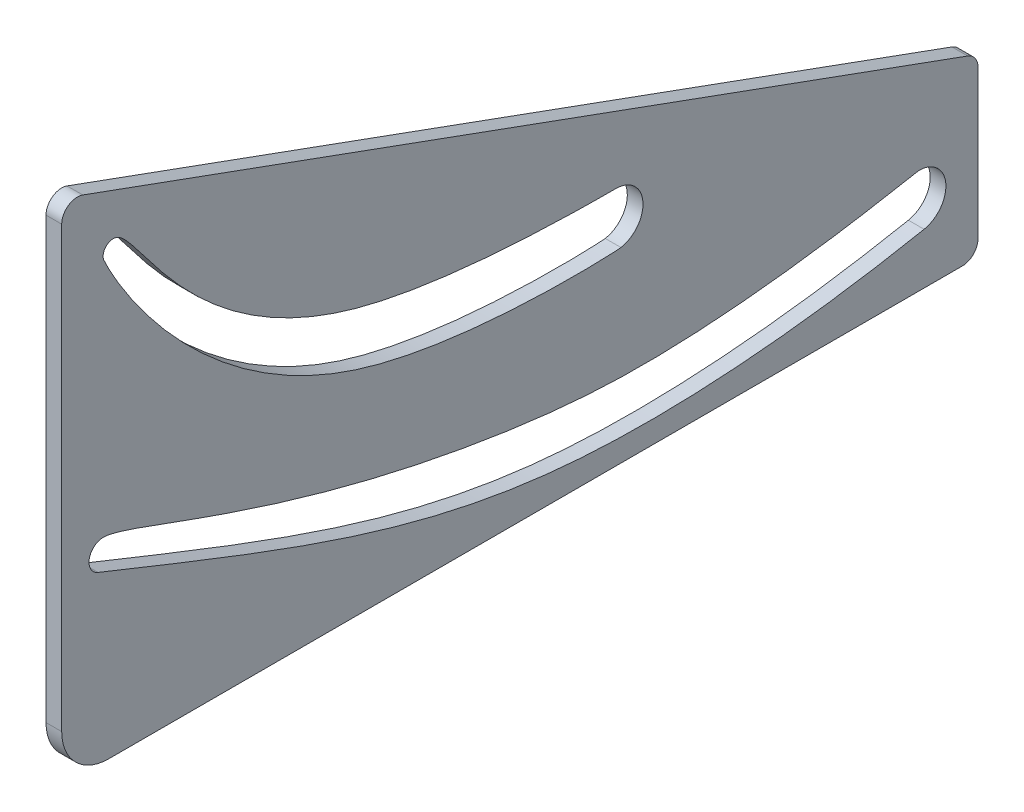
ISO-10303-21;
HEADER;
FILE_DESCRIPTION(('STEP AP214'),'2;1');
FILE_NAME('part.step','',(''),(''),'','','');
FILE_SCHEMA(('AUTOMOTIVE_DESIGN { 1 0 10303 214 1 1 1 1 }'));
ENDSEC;
DATA;
#1=APPLICATION_CONTEXT('core data for automotive mechanical design processes');
#2=APPLICATION_PROTOCOL_DEFINITION('international standard','automotive_design',2000,#1);
#3=PRODUCT_CONTEXT('',#1,'mechanical');
#4=PRODUCT('Part','Part','',(#3));
#5=PRODUCT_RELATED_PRODUCT_CATEGORY('part','',(#4));
#6=PRODUCT_DEFINITION_FORMATION('','',#4);
#7=PRODUCT_DEFINITION_CONTEXT('part definition',#1,'design');
#8=PRODUCT_DEFINITION('design','',#6,#7);
#9=PRODUCT_DEFINITION_SHAPE('','',#8);
#10=(LENGTH_UNIT() NAMED_UNIT(*) SI_UNIT(.MILLI.,.METRE.));
#11=(NAMED_UNIT(*) PLANE_ANGLE_UNIT() SI_UNIT($,.RADIAN.));
#12=(NAMED_UNIT(*) SI_UNIT($,.STERADIAN.) SOLID_ANGLE_UNIT());
#13=UNCERTAINTY_MEASURE_WITH_UNIT(LENGTH_MEASURE(1.E-05),#10,'distance_accuracy_value','');
#14=(GEOMETRIC_REPRESENTATION_CONTEXT(3) GLOBAL_UNCERTAINTY_ASSIGNED_CONTEXT((#13)) GLOBAL_UNIT_ASSIGNED_CONTEXT((#10,
#11,#12)) REPRESENTATION_CONTEXT('',''));
#15=CARTESIAN_POINT('',(0.,0.,0.));
#16=DIRECTION('',(0.,0.,1.));
#17=DIRECTION('',(1.,0.,0.));
#18=AXIS2_PLACEMENT_3D('',#15,#16,#17);
#19=CARTESIAN_POINT('',(10.,-294.281480067421,-30.));
#20=DIRECTION('',(-1.,0.,0.));
#21=DIRECTION('',(0.,0.,1.));
#22=AXIS2_PLACEMENT_3D('',#19,#20,#21);
#23=CYLINDRICAL_SURFACE('',#22,30.);
#24=CARTESIAN_POINT('',(0.,-294.281480067421,-30.));
#25=DIRECTION('',(1.,0.,0.));
#26=DIRECTION('',(0.,0.,1.));
#27=AXIS2_PLACEMENT_3D('',#24,#25,#26);
#28=CIRCLE('',#27,30.);
#29=CARTESIAN_POINT('',(0.,-294.281480067421,0.));
#30=VERTEX_POINT('',#29);
#31=CARTESIAN_POINT('',(0.,-324.281480067421,-30.));
#32=VERTEX_POINT('',#31);
#33=EDGE_CURVE('E251',#30,#32,#28,.T.);
#34=ORIENTED_EDGE('',*,*,#33,.T.);
#35=DIRECTION('',(-1.,0.,0.));
#36=VECTOR('',#35,1.);
#37=CARTESIAN_POINT('',(10.,-324.281480067421,-30.));
#38=LINE('',#37,#36);
#39=CARTESIAN_POINT('',(10.,-324.281480067421,-30.));
#40=VERTEX_POINT('',#39);
#41=EDGE_CURVE('E11',#40,#32,#38,.T.);
#42=ORIENTED_EDGE('',*,*,#41,.F.);
#43=CARTESIAN_POINT('',(10.,-294.281480067421,-30.));
#44=DIRECTION('',(1.,0.,0.));
#45=DIRECTION('',(0.,0.,1.));
#46=AXIS2_PLACEMENT_3D('',#43,#44,#45);
#47=CIRCLE('',#46,30.);
#48=CARTESIAN_POINT('',(10.,-294.281480067421,0.));
#49=VERTEX_POINT('',#48);
#50=EDGE_CURVE('E272',#49,#40,#47,.T.);
#51=ORIENTED_EDGE('',*,*,#50,.F.);
#52=DIRECTION('',(-1.,0.,0.));
#53=VECTOR('',#52,1.);
#54=CARTESIAN_POINT('',(10.,-294.281480067421,0.));
#55=LINE('',#54,#53);
#56=EDGE_CURVE('E273',#49,#30,#55,.T.);
#57=ORIENTED_EDGE('',*,*,#56,.T.);
#58=EDGE_LOOP('',(#34,#42,#51,#57));
#59=FACE_BOUND('',#58,.T.);
#60=ADVANCED_FACE('F36',(#59),#23,.T.);
#61=CARTESIAN_POINT('',(10.,-324.281480067421,-30.));
#62=DIRECTION('',(0.,1.,0.));
#63=DIRECTION('',(0.,0.,1.));
#64=AXIS2_PLACEMENT_3D('',#61,#62,#63);
#65=PLANE('',#64);
#66=DIRECTION('',(0.,0.,-1.));
#67=VECTOR('',#66,1.);
#68=CARTESIAN_POINT('',(0.,-324.281480067421,-30.));
#69=LINE('',#68,#67);
#70=CARTESIAN_POINT('',(0.,-324.281480067421,-573.815572471544));
#71=VERTEX_POINT('',#70);
#72=EDGE_CURVE('E242',#32,#71,#69,.T.);
#73=ORIENTED_EDGE('',*,*,#72,.T.);
#74=DIRECTION('',(-1.,0.,0.));
#75=VECTOR('',#74,1.);
#76=CARTESIAN_POINT('',(10.,-324.281480067421,-573.815572471544));
#77=LINE('',#76,#75);
#78=CARTESIAN_POINT('',(10.,-324.281480067421,-573.815572471544));
#79=VERTEX_POINT('',#78);
#80=EDGE_CURVE('E43',#79,#71,#77,.T.);
#81=ORIENTED_EDGE('',*,*,#80,.F.);
#82=DIRECTION('',(0.,0.,-1.));
#83=VECTOR('',#82,1.);
#84=CARTESIAN_POINT('',(10.,-324.281480067421,-30.));
#85=LINE('',#84,#83);
#86=EDGE_CURVE('E298',#40,#79,#85,.T.);
#87=ORIENTED_EDGE('',*,*,#86,.F.);
#88=ORIENTED_EDGE('',*,*,#41,.T.);
#89=EDGE_LOOP('',(#73,#81,#87,#88));
#90=FACE_BOUND('',#89,.T.);
#91=ADVANCED_FACE('F233',(#90),#65,.F.);
#92=CARTESIAN_POINT('',(10.,-314.281480067421,-573.815572471544));
#93=DIRECTION('',(-1.,0.,0.));
#94=DIRECTION('',(0.,0.,1.));
#95=AXIS2_PLACEMENT_3D('',#92,#93,#94);
#96=CYLINDRICAL_SURFACE('',#95,10.);
#97=CARTESIAN_POINT('',(0.,-314.281480067421,-573.815572471544));
#98=DIRECTION('',(1.,0.,0.));
#99=DIRECTION('',(0.,0.,-1.));
#100=AXIS2_PLACEMENT_3D('',#97,#98,#99);
#101=CIRCLE('',#100,10.);
#102=CARTESIAN_POINT('',(0.,-314.281480067421,-583.815572471544));
#103=VERTEX_POINT('',#102);
#104=EDGE_CURVE('E250',#71,#103,#101,.T.);
#105=ORIENTED_EDGE('',*,*,#104,.T.);
#106=DIRECTION('',(-1.,0.,0.));
#107=VECTOR('',#106,1.);
#108=CARTESIAN_POINT('',(10.,-314.281480067421,-583.815572471544));
#109=LINE('',#108,#107);
#110=CARTESIAN_POINT('',(10.,-314.281480067421,-583.815572471544));
#111=VERTEX_POINT('',#110);
#112=EDGE_CURVE('E256',#111,#103,#109,.T.);
#113=ORIENTED_EDGE('',*,*,#112,.F.);
#114=CARTESIAN_POINT('',(10.,-314.281480067421,-573.815572471544));
#115=DIRECTION('',(1.,0.,0.));
#116=DIRECTION('',(0.,0.,-1.));
#117=AXIS2_PLACEMENT_3D('',#114,#115,#116);
#118=CIRCLE('',#117,10.);
#119=EDGE_CURVE('E255',#79,#111,#118,.T.);
#120=ORIENTED_EDGE('',*,*,#119,.F.);
#121=ORIENTED_EDGE('',*,*,#80,.T.);
#122=EDGE_LOOP('',(#105,#113,#120,#121));
#123=FACE_BOUND('',#122,.T.);
#124=ADVANCED_FACE('F230',(#123),#96,.T.);
#125=CARTESIAN_POINT('',(10.,-314.281480067421,-583.815572471544));
#126=DIRECTION('',(0.,0.,1.));
#127=DIRECTION('',(1.,0.,0.));
#128=AXIS2_PLACEMENT_3D('',#125,#126,#127);
#129=PLANE('',#128);
#130=DIRECTION('',(0.,1.,0.));
#131=VECTOR('',#130,1.);
#132=CARTESIAN_POINT('',(0.,-314.281480067421,-583.815572471544));
#133=LINE('',#132,#131);
#134=CARTESIAN_POINT('',(0.,-219.493566062825,-583.815572471544));
#135=VERTEX_POINT('',#134);
#136=EDGE_CURVE('E259',#103,#135,#133,.T.);
#137=ORIENTED_EDGE('',*,*,#136,.T.);
#138=DIRECTION('',(-1.,0.,0.));
#139=VECTOR('',#138,1.);
#140=CARTESIAN_POINT('',(10.,-219.493566062825,-583.815572471544));
#141=LINE('',#140,#139);
#142=CARTESIAN_POINT('',(10.,-219.493566062825,-583.815572471544));
#143=VERTEX_POINT('',#142);
#144=EDGE_CURVE('E286',#143,#135,#141,.T.);
#145=ORIENTED_EDGE('',*,*,#144,.F.);
#146=DIRECTION('',(0.,1.,0.));
#147=VECTOR('',#146,1.);
#148=CARTESIAN_POINT('',(10.,-314.281480067421,-583.815572471544));
#149=LINE('',#148,#147);
#150=EDGE_CURVE('E291',#111,#143,#149,.T.);
#151=ORIENTED_EDGE('',*,*,#150,.F.);
#152=ORIENTED_EDGE('',*,*,#112,.T.);
#153=EDGE_LOOP('',(#137,#145,#151,#152));
#154=FACE_BOUND('',#153,.T.);
#155=ADVANCED_FACE('F226',(#154),#129,.F.);
#156=CARTESIAN_POINT('',(10.,-219.493566062825,-573.815572471544));
#157=DIRECTION('',(-1.,0.,0.));
#158=DIRECTION('',(0.,0.,1.));
#159=AXIS2_PLACEMENT_3D('',#156,#157,#158);
#160=CYLINDRICAL_SURFACE('',#159,10.);
#161=CARTESIAN_POINT('',(0.,-219.493566062825,-573.815572471544));
#162=DIRECTION('',(1.,0.,0.));
#163=DIRECTION('',(0.,0.,-1.));
#164=AXIS2_PLACEMENT_3D('',#161,#162,#163);
#165=CIRCLE('',#164,10.);
#166=CARTESIAN_POINT('',(0.,-210.096639854966,-577.235773904801));
#167=VERTEX_POINT('',#166);
#168=EDGE_CURVE('E261',#135,#167,#165,.T.);
#169=ORIENTED_EDGE('',*,*,#168,.T.);
#170=DIRECTION('',(-1.,0.,0.));
#171=VECTOR('',#170,1.);
#172=CARTESIAN_POINT('',(10.,-210.096639854966,-577.235773904801));
#173=LINE('',#172,#171);
#174=CARTESIAN_POINT('',(10.,-210.096639854966,-577.235773904801));
#175=VERTEX_POINT('',#174);
#176=EDGE_CURVE('E283',#175,#167,#173,.T.);
#177=ORIENTED_EDGE('',*,*,#176,.F.);
#178=CARTESIAN_POINT('',(10.,-219.493566062825,-573.815572471544));
#179=DIRECTION('',(1.,0.,0.));
#180=DIRECTION('',(0.,0.,-1.));
#181=AXIS2_PLACEMENT_3D('',#178,#179,#180);
#182=CIRCLE('',#181,10.);
#183=EDGE_CURVE('E294',#143,#175,#182,.T.);
#184=ORIENTED_EDGE('',*,*,#183,.F.);
#185=ORIENTED_EDGE('',*,*,#144,.T.);
#186=EDGE_LOOP('',(#169,#177,#184,#185));
#187=FACE_BOUND('',#186,.T.);
#188=ADVANCED_FACE('F222',(#187),#160,.T.);
#189=CARTESIAN_POINT('',(10.,-210.096639854966,-577.235773904801));
#190=DIRECTION('',(0.,-0.939692620785907,0.342020143325672));
#191=DIRECTION('',(0.,-0.342020143325672,-0.939692620785907));
#192=AXIS2_PLACEMENT_3D('',#189,#190,#191);
#193=PLANE('',#192);
#194=DIRECTION('',(0.,0.342020143325672,0.939692620785907));
#195=VECTOR('',#194,1.);
#196=CARTESIAN_POINT('',(0.,-210.096639854966,-577.235773904801));
#197=LINE('',#196,#195);
#198=CARTESIAN_POINT('',(0.,-4.88455385956217,-13.4202014332568));
#199=VERTEX_POINT('',#198);
#200=EDGE_CURVE('E266',#167,#199,#197,.T.);
#201=ORIENTED_EDGE('',*,*,#200,.T.);
#202=DIRECTION('',(-1.,0.,0.));
#203=VECTOR('',#202,1.);
#204=CARTESIAN_POINT('',(10.,-4.88455385956217,-13.4202014332568));
#205=LINE('',#204,#203);
#206=CARTESIAN_POINT('',(10.,-4.88455385956217,-13.4202014332568));
#207=VERTEX_POINT('',#206);
#208=EDGE_CURVE('E280',#207,#199,#205,.T.);
#209=ORIENTED_EDGE('',*,*,#208,.F.);
#210=DIRECTION('',(0.,0.342020143325672,0.939692620785907));
#211=VECTOR('',#210,1.);
#212=CARTESIAN_POINT('',(10.,-210.096639854966,-577.235773904801));
#213=LINE('',#212,#211);
#214=EDGE_CURVE('E296',#175,#207,#213,.T.);
#215=ORIENTED_EDGE('',*,*,#214,.F.);
#216=ORIENTED_EDGE('',*,*,#176,.T.);
#217=EDGE_LOOP('',(#201,#209,#215,#216));
#218=FACE_BOUND('',#217,.T.);
#219=ADVANCED_FACE('F218',(#218),#193,.F.);
#220=CARTESIAN_POINT('',(10.,-14.2814800674212,-10.));
#221=DIRECTION('',(-1.,0.,0.));
#222=DIRECTION('',(0.,0.,1.));
#223=AXIS2_PLACEMENT_3D('',#220,#221,#222);
#224=CYLINDRICAL_SURFACE('',#223,10.);
#225=CARTESIAN_POINT('',(0.,-14.2814800674212,-10.));
#226=DIRECTION('',(1.,0.,0.));
#227=DIRECTION('',(0.,0.,-1.));
#228=AXIS2_PLACEMENT_3D('',#225,#226,#227);
#229=CIRCLE('',#228,10.);
#230=CARTESIAN_POINT('',(0.,-14.2814800674213,0.));
#231=VERTEX_POINT('',#230);
#232=EDGE_CURVE('E268',#199,#231,#229,.T.);
#233=ORIENTED_EDGE('',*,*,#232,.T.);
#234=DIRECTION('',(-1.,0.,0.));
#235=VECTOR('',#234,1.);
#236=CARTESIAN_POINT('',(10.,-14.2814800674213,0.));
#237=LINE('',#236,#235);
#238=CARTESIAN_POINT('',(10.,-14.2814800674213,0.));
#239=VERTEX_POINT('',#238);
#240=EDGE_CURVE('E276',#239,#231,#237,.T.);
#241=ORIENTED_EDGE('',*,*,#240,.F.);
#242=CARTESIAN_POINT('',(10.,-14.2814800674212,-10.));
#243=DIRECTION('',(1.,0.,0.));
#244=DIRECTION('',(0.,0.,-1.));
#245=AXIS2_PLACEMENT_3D('',#242,#243,#244);
#246=CIRCLE('',#245,10.);
#247=EDGE_CURVE('E303',#207,#239,#246,.T.);
#248=ORIENTED_EDGE('',*,*,#247,.F.);
#249=ORIENTED_EDGE('',*,*,#208,.T.);
#250=EDGE_LOOP('',(#233,#241,#248,#249));
#251=FACE_BOUND('',#250,.T.);
#252=ADVANCED_FACE('F214',(#251),#224,.T.);
#253=CARTESIAN_POINT('',(10.,-14.2814800674213,0.));
#254=DIRECTION('',(0.,0.,-1.));
#255=DIRECTION('',(0.,1.,0.));
#256=AXIS2_PLACEMENT_3D('',#253,#254,#255);
#257=PLANE('',#256);
#258=DIRECTION('',(0.,-1.,0.));
#259=VECTOR('',#258,1.);
#260=CARTESIAN_POINT('',(0.,-14.2814800674213,0.));
#261=LINE('',#260,#259);
#262=EDGE_CURVE('E270',#231,#30,#261,.T.);
#263=ORIENTED_EDGE('',*,*,#262,.T.);
#264=ORIENTED_EDGE('',*,*,#56,.F.);
#265=DIRECTION('',(0.,-1.,0.));
#266=VECTOR('',#265,1.);
#267=CARTESIAN_POINT('',(10.,-14.2814800674213,0.));
#268=LINE('',#267,#266);
#269=EDGE_CURVE('E277',#239,#49,#268,.T.);
#270=ORIENTED_EDGE('',*,*,#269,.F.);
#271=ORIENTED_EDGE('',*,*,#240,.T.);
#272=EDGE_LOOP('',(#263,#264,#270,#271));
#273=FACE_BOUND('',#272,.T.);
#274=ADVANCED_FACE('F208',(#273),#257,.F.);
#275=CARTESIAN_POINT('',(10.,-294.281480067421,-30.));
#276=DIRECTION('',(-1.,0.,0.));
#277=DIRECTION('',(0.,0.,1.));
#278=AXIS2_PLACEMENT_3D('',#275,#276,#277);
#279=PLANE('',#278);
#280=CARTESIAN_POINT('',(10.,-188.394419043439,-353.169539728973));
#281=DIRECTION('',(-1.,0.,0.));
#282=DIRECTION('',(0.,0.,1.));
#283=AXIS2_PLACEMENT_3D('',#280,#281,#282);
#284=CIRCLE('',#283,17.2126847464395);
#285=CARTESIAN_POINT('',(10.,-171.181734297002,-353.169530365349));
#286=VERTEX_POINT('',#285);
#287=CARTESIAN_POINT('',(10.,-205.316311304832,-356.320107689534));
#288=VERTEX_POINT('',#287);
#289=EDGE_CURVE('E307',#286,#288,#284,.T.);
#290=ORIENTED_EDGE('',*,*,#289,.T.);
#291=CARTESIAN_POINT('',(10.,-205.316311304833,-356.320107689534));
#292=CARTESIAN_POINT('',(10.,-205.964445920581,-352.838937222534));
#293=CARTESIAN_POINT('',(10.,-217.989087479131,-121.396454164475));
#294=CARTESIAN_POINT('',(10.,-66.6295550857602,-35.3127262433403));
#295=CARTESIAN_POINT('',(10.,-47.7372149956287,-26.9501856712703));
#296=B_SPLINE_CURVE_WITH_KNOTS('',3,(#291,#292,#293,#294,#295),.UNSPECIFIED.,.F.,.F.,(4,1,4),
(0.,0.409684669558369,1.),.UNSPECIFIED.);
#297=CARTESIAN_POINT('',(10.,-47.7372149956287,-26.9501856712703));
#298=VERTEX_POINT('',#297);
#299=EDGE_CURVE('E305',#288,#298,#296,.T.);
#300=ORIENTED_EDGE('',*,*,#299,.T.);
#301=CARTESIAN_POINT('',(10.,-45.1404123394199,-32.8167854808913));
#302=DIRECTION('',(-1.,0.,0.));
#303=DIRECTION('',(0.,0.,1.));
#304=AXIS2_PLACEMENT_3D('',#301,#302,#303);
#305=CIRCLE('',#304,6.41563538252756);
#306=CARTESIAN_POINT('',(10.,-39.1543533593346,-35.1249178966076));
#307=VERTEX_POINT('',#306);
#308=EDGE_CURVE('E333',#298,#307,#305,.T.);
#309=ORIENTED_EDGE('',*,*,#308,.T.);
#310=CARTESIAN_POINT('',(10.,-39.1543533593346,-35.1249178966076));
#311=CARTESIAN_POINT('',(10.,-45.1224459351378,-50.6029528282735));
#312=CARTESIAN_POINT('',(10.,-170.661871262547,-99.0425390004754));
#313=CARTESIAN_POINT('',(10.,-171.181746235272,-331.224003862466));
#314=CARTESIAN_POINT('',(10.,-171.181734297002,-353.169530365349));
#315=B_SPLINE_CURVE_WITH_KNOTS('',3,(#310,#311,#312,#313,#314),.UNSPECIFIED.,.F.,.F.,(4,1,4),
(0.,0.639195597187541,1.),.UNSPECIFIED.);
#316=EDGE_CURVE('E153',#307,#286,#315,.T.);
#317=ORIENTED_EDGE('',*,*,#316,.T.);
#318=EDGE_LOOP('',(#290,#300,#309,#317));
#319=FACE_BOUND('',#318,.T.);
#320=CARTESIAN_POINT('',(10.,-274.942255754465,-546.15811937726));
#321=DIRECTION('',(-1.,0.,0.));
#322=DIRECTION('',(0.,0.,1.));
#323=AXIS2_PLACEMENT_3D('',#320,#321,#322);
#324=CIRCLE('',#323,17.2112260755334);
#325=CARTESIAN_POINT('',(10.,-257.731029978854,-546.154906268973));
#326=VERTEX_POINT('',#325);
#327=CARTESIAN_POINT('',(10.,-291.831036848789,-549.474047025916));
#328=VERTEX_POINT('',#327);
#329=EDGE_CURVE('E343',#326,#328,#324,.T.);
#330=ORIENTED_EDGE('',*,*,#329,.T.);
#331=CARTESIAN_POINT('',(10.,-291.831036848789,-549.474047025916));
#332=CARTESIAN_POINT('',(10.,-306.502271197421,-474.750080898962));
#333=CARTESIAN_POINT('',(10.,-324.572171749127,-284.669923622883));
#334=CARTESIAN_POINT('',(10.,-266.034178467192,-143.080818041075));
#335=CARTESIAN_POINT('',(10.,-218.017297736922,-23.1621757846725));
#336=B_SPLINE_CURVE_WITH_KNOTS('',3,(#331,#332,#333,#334,#335),.UNSPECIFIED.,.F.,.F.,(4,1,4),
(0.,0.423888314021505,1.),.UNSPECIFIED.);
#337=CARTESIAN_POINT('',(10.,-218.017297736922,-23.1621757846725));
#338=VERTEX_POINT('',#337);
#339=EDGE_CURVE('E338',#328,#338,#336,.T.);
#340=ORIENTED_EDGE('',*,*,#339,.T.);
#341=CARTESIAN_POINT('',(10.,-209.495939813425,-26.5742309862116));
#342=DIRECTION('',(-1.,0.,0.));
#343=DIRECTION('',(0.,0.,1.));
#344=AXIS2_PLACEMENT_3D('',#341,#342,#343);
#345=CIRCLE('',#344,9.17908827491534);
#346=CARTESIAN_POINT('',(10.,-200.318314743193,-26.7381200613058));
#347=VERTEX_POINT('',#346);
#348=EDGE_CURVE('E354',#338,#347,#345,.T.);
#349=ORIENTED_EDGE('',*,*,#348,.T.);
#350=CARTESIAN_POINT('',(10.,-200.318314743193,-26.7381200613058));
#351=CARTESIAN_POINT('',(10.,-200.660753586686,-45.9143544336099));
#352=CARTESIAN_POINT('',(10.,-255.510398156368,-151.321073340182));
#353=CARTESIAN_POINT('',(10.,-286.385074175091,-414.880335600918));
#354=CARTESIAN_POINT('',(10.,-257.731725159021,-542.431128001591));
#355=CARTESIAN_POINT('',(10.,-257.731029978854,-546.154906268973));
#356=B_SPLINE_CURVE_WITH_KNOTS('',3,(#350,#351,#352,#353,#354,#355),.UNSPECIFIED.,.F.,.F.,(4,1,
1,4),(0.,0.560935224009475,0.660935224009475,1.),.UNSPECIFIED.);
#357=EDGE_CURVE('E349',#347,#326,#356,.T.);
#358=ORIENTED_EDGE('',*,*,#357,.T.);
#359=EDGE_LOOP('',(#330,#340,#349,#358));
#360=FACE_BOUND('',#359,.T.);
#361=ORIENTED_EDGE('',*,*,#50,.T.);
#362=ORIENTED_EDGE('',*,*,#86,.T.);
#363=ORIENTED_EDGE('',*,*,#119,.T.);
#364=ORIENTED_EDGE('',*,*,#150,.T.);
#365=ORIENTED_EDGE('',*,*,#183,.T.);
#366=ORIENTED_EDGE('',*,*,#214,.T.);
#367=ORIENTED_EDGE('',*,*,#247,.T.);
#368=ORIENTED_EDGE('',*,*,#269,.T.);
#369=EDGE_LOOP('',(#361,#362,#363,#364,#365,#366,#367,#368));
#370=FACE_BOUND('',#369,.T.);
#371=ADVANCED_FACE('F205',(#319,#360,#370),#279,.F.);
#372=CARTESIAN_POINT('',(0.,-294.281480067421,-30.));
#373=DIRECTION('',(-1.,0.,0.));
#374=DIRECTION('',(0.,0.,1.));
#375=AXIS2_PLACEMENT_3D('',#372,#373,#374);
#376=PLANE('',#375);
#377=CARTESIAN_POINT('',(0.,-205.316311304833,-356.320107689534));
#378=CARTESIAN_POINT('',(0.,-205.964445920581,-352.838937222534));
#379=CARTESIAN_POINT('',(0.,-217.989087479131,-121.396454164475));
#380=CARTESIAN_POINT('',(0.,-66.6295550857602,-35.3127262433403));
#381=CARTESIAN_POINT('',(0.,-47.7372149956287,-26.9501856712703));
#382=B_SPLINE_CURVE_WITH_KNOTS('',3,(#377,#378,#379,#380,#381),.UNSPECIFIED.,.F.,.F.,(4,1,4),
(0.,0.409684669558369,1.),.UNSPECIFIED.);
#383=CARTESIAN_POINT('',(0.,-205.316311304832,-356.320107689534));
#384=VERTEX_POINT('',#383);
#385=CARTESIAN_POINT('',(0.,-47.7372149956287,-26.9501856712703));
#386=VERTEX_POINT('',#385);
#387=EDGE_CURVE('E165',#384,#386,#382,.T.);
#388=ORIENTED_EDGE('',*,*,#387,.F.);
#389=CARTESIAN_POINT('',(0.,-188.394419043439,-353.169539728973));
#390=DIRECTION('',(-1.,0.,0.));
#391=DIRECTION('',(0.,0.,1.));
#392=AXIS2_PLACEMENT_3D('',#389,#390,#391);
#393=CIRCLE('',#392,17.2126847464395);
#394=CARTESIAN_POINT('',(0.,-171.181734297002,-353.169530365349));
#395=VERTEX_POINT('',#394);
#396=EDGE_CURVE('E170',#395,#384,#393,.T.);
#397=ORIENTED_EDGE('',*,*,#396,.F.);
#398=CARTESIAN_POINT('',(0.,-39.1543533593346,-35.1249178966076));
#399=CARTESIAN_POINT('',(0.,-45.1224459351378,-50.6029528282735));
#400=CARTESIAN_POINT('',(0.,-170.661871262547,-99.0425390004754));
#401=CARTESIAN_POINT('',(0.,-171.181746235272,-331.224003862466));
#402=CARTESIAN_POINT('',(0.,-171.181734297002,-353.169530365349));
#403=B_SPLINE_CURVE_WITH_KNOTS('',3,(#398,#399,#400,#401,#402),.UNSPECIFIED.,.F.,.F.,(4,1,4),
(0.,0.639195597187541,1.),.UNSPECIFIED.);
#404=CARTESIAN_POINT('',(0.,-39.1543533593346,-35.1249178966076));
#405=VERTEX_POINT('',#404);
#406=EDGE_CURVE('E150',#405,#395,#403,.T.);
#407=ORIENTED_EDGE('',*,*,#406,.F.);
#408=CARTESIAN_POINT('',(0.,-45.1404123394199,-32.8167854808913));
#409=DIRECTION('',(-1.,0.,0.));
#410=DIRECTION('',(0.,0.,1.));
#411=AXIS2_PLACEMENT_3D('',#408,#409,#410);
#412=CIRCLE('',#411,6.41563538252756);
#413=EDGE_CURVE('E160',#386,#405,#412,.T.);
#414=ORIENTED_EDGE('',*,*,#413,.F.);
#415=EDGE_LOOP('',(#388,#397,#407,#414));
#416=FACE_BOUND('',#415,.T.);
#417=CARTESIAN_POINT('',(0.,-291.831036848789,-549.474047025916));
#418=CARTESIAN_POINT('',(0.,-306.502271197421,-474.750080898962));
#419=CARTESIAN_POINT('',(0.,-324.572171749127,-284.669923622883));
#420=CARTESIAN_POINT('',(0.,-266.034178467192,-143.080818041075));
#421=CARTESIAN_POINT('',(0.,-218.017297736922,-23.1621757846725));
#422=B_SPLINE_CURVE_WITH_KNOTS('',3,(#417,#418,#419,#420,#421),.UNSPECIFIED.,.F.,.F.,(4,1,4),
(0.,0.423888314021505,1.),.UNSPECIFIED.);
#423=CARTESIAN_POINT('',(0.,-291.831036848789,-549.474047025916));
#424=VERTEX_POINT('',#423);
#425=CARTESIAN_POINT('',(0.,-218.017297736922,-23.1621757846725));
#426=VERTEX_POINT('',#425);
#427=EDGE_CURVE('E182',#424,#426,#422,.T.);
#428=ORIENTED_EDGE('',*,*,#427,.F.);
#429=CARTESIAN_POINT('',(0.,-274.942255754465,-546.15811937726));
#430=DIRECTION('',(-1.,0.,0.));
#431=DIRECTION('',(0.,0.,1.));
#432=AXIS2_PLACEMENT_3D('',#429,#430,#431);
#433=CIRCLE('',#432,17.2112260755334);
#434=CARTESIAN_POINT('',(0.,-257.731029978854,-546.154906268973));
#435=VERTEX_POINT('',#434);
#436=EDGE_CURVE('E364',#435,#424,#433,.T.);
#437=ORIENTED_EDGE('',*,*,#436,.F.);
#438=CARTESIAN_POINT('',(0.,-200.318314743193,-26.7381200613058));
#439=CARTESIAN_POINT('',(0.,-200.660753586686,-45.9143544336099));
#440=CARTESIAN_POINT('',(0.,-255.510398156368,-151.321073340182));
#441=CARTESIAN_POINT('',(0.,-286.385074175091,-414.880335600918));
#442=CARTESIAN_POINT('',(0.,-257.731725159021,-542.431128001591));
#443=CARTESIAN_POINT('',(0.,-257.731029978854,-546.154906268973));
#444=B_SPLINE_CURVE_WITH_KNOTS('',3,(#438,#439,#440,#441,#442,#443),.UNSPECIFIED.,.F.,.F.,(4,1,
1,4),(0.,0.560935224009475,0.660935224009475,1.),.UNSPECIFIED.);
#445=CARTESIAN_POINT('',(0.,-200.318314743193,-26.7381200613058));
#446=VERTEX_POINT('',#445);
#447=EDGE_CURVE('E371',#446,#435,#444,.T.);
#448=ORIENTED_EDGE('',*,*,#447,.F.);
#449=CARTESIAN_POINT('',(0.,-209.495939813425,-26.5742309862116));
#450=DIRECTION('',(-1.,0.,0.));
#451=DIRECTION('',(0.,0.,1.));
#452=AXIS2_PLACEMENT_3D('',#449,#450,#451);
#453=CIRCLE('',#452,9.17908827491534);
#454=EDGE_CURVE('E376',#426,#446,#453,.T.);
#455=ORIENTED_EDGE('',*,*,#454,.F.);
#456=EDGE_LOOP('',(#428,#437,#448,#455));
#457=FACE_BOUND('',#456,.T.);
#458=ORIENTED_EDGE('',*,*,#33,.F.);
#459=ORIENTED_EDGE('',*,*,#262,.F.);
#460=ORIENTED_EDGE('',*,*,#232,.F.);
#461=ORIENTED_EDGE('',*,*,#200,.F.);
#462=ORIENTED_EDGE('',*,*,#168,.F.);
#463=ORIENTED_EDGE('',*,*,#136,.F.);
#464=ORIENTED_EDGE('',*,*,#104,.F.);
#465=ORIENTED_EDGE('',*,*,#72,.F.);
#466=EDGE_LOOP('',(#458,#459,#460,#461,#462,#463,#464,#465));
#467=FACE_BOUND('',#466,.T.);
#468=ADVANCED_FACE('F167',(#416,#457,#467),#376,.T.);
#469=CARTESIAN_POINT('',(33.,-291.831036848789,-549.474047025916));
#470=CARTESIAN_POINT('',(33.,-306.502271197421,-474.750080898962));
#471=CARTESIAN_POINT('',(33.,-324.572171749127,-284.669923622883));
#472=CARTESIAN_POINT('',(33.,-266.034178467192,-143.080818041075));
#473=CARTESIAN_POINT('',(33.,-218.017297736922,-23.1621757846725));
#474=B_SPLINE_CURVE_WITH_KNOTS('',3,(#469,#470,#471,#472,#473),.UNSPECIFIED.,.F.,.F.,(4,1,4),
(0.,0.423888314021505,1.),.UNSPECIFIED.);
#475=DIRECTION('',(-1.,0.,0.));
#476=VECTOR('',#475,1.);
#477=SURFACE_OF_LINEAR_EXTRUSION('',#474,#476);
#478=DIRECTION('',(-1.,0.,0.));
#479=VECTOR('',#478,1.);
#480=CARTESIAN_POINT('',(33.,-291.831036848789,-549.474047025916));
#481=LINE('',#480,#479);
#482=EDGE_CURVE('E360',#328,#424,#481,.T.);
#483=ORIENTED_EDGE('',*,*,#482,.T.);
#484=ORIENTED_EDGE('',*,*,#427,.T.);
#485=DIRECTION('',(-1.,0.,0.));
#486=VECTOR('',#485,1.);
#487=CARTESIAN_POINT('',(33.,-218.017297736922,-23.1621757846725));
#488=LINE('',#487,#486);
#489=EDGE_CURVE('E361',#338,#426,#488,.T.);
#490=ORIENTED_EDGE('',*,*,#489,.F.);
#491=ORIENTED_EDGE('',*,*,#339,.F.);
#492=EDGE_LOOP('',(#483,#484,#490,#491));
#493=FACE_BOUND('',#492,.T.);
#494=ADVANCED_FACE('F197',(#493),#477,.F.);
#495=CARTESIAN_POINT('',(33.,-274.942255754465,-546.15811937726));
#496=DIRECTION('',(-1.,0.,0.));
#497=DIRECTION('',(0.,0.,1.));
#498=AXIS2_PLACEMENT_3D('',#495,#496,#497);
#499=CYLINDRICAL_SURFACE('',#498,17.2112260755334);
#500=DIRECTION('',(-1.,0.,0.));
#501=VECTOR('',#500,1.);
#502=CARTESIAN_POINT('',(33.,-257.731029978854,-546.154906268973));
#503=LINE('',#502,#501);
#504=EDGE_CURVE('E366',#326,#435,#503,.T.);
#505=ORIENTED_EDGE('',*,*,#504,.T.);
#506=ORIENTED_EDGE('',*,*,#436,.T.);
#507=ORIENTED_EDGE('',*,*,#482,.F.);
#508=ORIENTED_EDGE('',*,*,#329,.F.);
#509=EDGE_LOOP('',(#505,#506,#507,#508));
#510=FACE_BOUND('',#509,.T.);
#511=ADVANCED_FACE('F201',(#510),#499,.F.);
#512=CARTESIAN_POINT('',(33.,-200.318314743193,-26.7381200613058));
#513=CARTESIAN_POINT('',(33.,-200.660753586686,-45.9143544336099));
#514=CARTESIAN_POINT('',(33.,-255.510398156368,-151.321073340182));
#515=CARTESIAN_POINT('',(33.,-286.385074175091,-414.880335600918));
#516=CARTESIAN_POINT('',(33.,-257.731725159021,-542.431128001591));
#517=CARTESIAN_POINT('',(33.,-257.731029978854,-546.154906268973));
#518=B_SPLINE_CURVE_WITH_KNOTS('',3,(#512,#513,#514,#515,#516,#517),.UNSPECIFIED.,.F.,.F.,(4,1,
1,4),(0.,0.560935224009475,0.660935224009475,1.),.UNSPECIFIED.);
#519=DIRECTION('',(-1.,0.,0.));
#520=VECTOR('',#519,1.);
#521=SURFACE_OF_LINEAR_EXTRUSION('',#518,#520);
#522=DIRECTION('',(-1.,0.,0.));
#523=VECTOR('',#522,1.);
#524=CARTESIAN_POINT('',(33.,-200.318314743193,-26.7381200613058));
#525=LINE('',#524,#523);
#526=EDGE_CURVE('E58',#347,#446,#525,.T.);
#527=ORIENTED_EDGE('',*,*,#526,.T.);
#528=ORIENTED_EDGE('',*,*,#447,.T.);
#529=ORIENTED_EDGE('',*,*,#504,.F.);
#530=ORIENTED_EDGE('',*,*,#357,.F.);
#531=EDGE_LOOP('',(#527,#528,#529,#530));
#532=FACE_BOUND('',#531,.T.);
#533=ADVANCED_FACE('F393',(#532),#521,.F.);
#534=CARTESIAN_POINT('',(33.,-209.495939813425,-26.5742309862116));
#535=DIRECTION('',(-1.,0.,0.));
#536=DIRECTION('',(0.,0.,1.));
#537=AXIS2_PLACEMENT_3D('',#534,#535,#536);
#538=CYLINDRICAL_SURFACE('',#537,9.17908827491534);
#539=ORIENTED_EDGE('',*,*,#489,.T.);
#540=ORIENTED_EDGE('',*,*,#454,.T.);
#541=ORIENTED_EDGE('',*,*,#526,.F.);
#542=ORIENTED_EDGE('',*,*,#348,.F.);
#543=EDGE_LOOP('',(#539,#540,#541,#542));
#544=FACE_BOUND('',#543,.T.);
#545=ADVANCED_FACE('F203',(#544),#538,.F.);
#546=CARTESIAN_POINT('',(33.,-205.316311304833,-356.320107689534));
#547=CARTESIAN_POINT('',(33.,-205.964445920581,-352.838937222534));
#548=CARTESIAN_POINT('',(33.,-217.989087479131,-121.396454164475));
#549=CARTESIAN_POINT('',(33.,-66.6295550857602,-35.3127262433403));
#550=CARTESIAN_POINT('',(33.,-47.7372149956287,-26.9501856712703));
#551=B_SPLINE_CURVE_WITH_KNOTS('',3,(#546,#547,#548,#549,#550),.UNSPECIFIED.,.F.,.F.,(4,1,4),
(0.,0.409684669558369,1.),.UNSPECIFIED.);
#552=DIRECTION('',(-1.,0.,0.));
#553=VECTOR('',#552,1.);
#554=SURFACE_OF_LINEAR_EXTRUSION('',#551,#553);
#555=DIRECTION('',(-1.,0.,0.));
#556=VECTOR('',#555,1.);
#557=CARTESIAN_POINT('',(33.,-205.316311304832,-356.320107689534));
#558=LINE('',#557,#556);
#559=EDGE_CURVE('E180',#288,#384,#558,.T.);
#560=ORIENTED_EDGE('',*,*,#559,.T.);
#561=ORIENTED_EDGE('',*,*,#387,.T.);
#562=DIRECTION('',(-1.,0.,0.));
#563=VECTOR('',#562,1.);
#564=CARTESIAN_POINT('',(33.,-47.7372149956287,-26.9501856712703));
#565=LINE('',#564,#563);
#566=EDGE_CURVE('E156',#298,#386,#565,.T.);
#567=ORIENTED_EDGE('',*,*,#566,.F.);
#568=ORIENTED_EDGE('',*,*,#299,.F.);
#569=EDGE_LOOP('',(#560,#561,#567,#568));
#570=FACE_BOUND('',#569,.T.);
#571=ADVANCED_FACE('F402',(#570),#554,.F.);
#572=CARTESIAN_POINT('',(33.,-188.394419043439,-353.169539728973));
#573=DIRECTION('',(-1.,0.,0.));
#574=DIRECTION('',(0.,0.,1.));
#575=AXIS2_PLACEMENT_3D('',#572,#573,#574);
#576=CYLINDRICAL_SURFACE('',#575,17.2126847464395);
#577=DIRECTION('',(-1.,0.,0.));
#578=VECTOR('',#577,1.);
#579=CARTESIAN_POINT('',(33.,-171.181734297002,-353.169530365349));
#580=LINE('',#579,#578);
#581=EDGE_CURVE('E155',#286,#395,#580,.T.);
#582=ORIENTED_EDGE('',*,*,#581,.T.);
#583=ORIENTED_EDGE('',*,*,#396,.T.);
#584=ORIENTED_EDGE('',*,*,#559,.F.);
#585=ORIENTED_EDGE('',*,*,#289,.F.);
#586=EDGE_LOOP('',(#582,#583,#584,#585));
#587=FACE_BOUND('',#586,.T.);
#588=ADVANCED_FACE('F406',(#587),#576,.F.);
#589=CARTESIAN_POINT('',(33.,-39.1543533593346,-35.1249178966076));
#590=CARTESIAN_POINT('',(33.,-45.1224459351378,-50.6029528282735));
#591=CARTESIAN_POINT('',(33.,-170.661871262547,-99.0425390004754));
#592=CARTESIAN_POINT('',(33.,-171.181746235272,-331.224003862466));
#593=CARTESIAN_POINT('',(33.,-171.181734297002,-353.169530365349));
#594=B_SPLINE_CURVE_WITH_KNOTS('',3,(#589,#590,#591,#592,#593),.UNSPECIFIED.,.F.,.F.,(4,1,4),
(0.,0.639195597187541,1.),.UNSPECIFIED.);
#595=DIRECTION('',(-1.,0.,0.));
#596=VECTOR('',#595,1.);
#597=SURFACE_OF_LINEAR_EXTRUSION('',#594,#596);
#598=DIRECTION('',(-1.,0.,0.));
#599=VECTOR('',#598,1.);
#600=CARTESIAN_POINT('',(33.,-39.1543533593346,-35.1249178966076));
#601=LINE('',#600,#599);
#602=EDGE_CURVE('E50',#307,#405,#601,.T.);
#603=ORIENTED_EDGE('',*,*,#602,.T.);
#604=ORIENTED_EDGE('',*,*,#406,.T.);
#605=ORIENTED_EDGE('',*,*,#581,.F.);
#606=ORIENTED_EDGE('',*,*,#316,.F.);
#607=EDGE_LOOP('',(#603,#604,#605,#606));
#608=FACE_BOUND('',#607,.T.);
#609=ADVANCED_FACE('F147',(#608),#597,.F.);
#610=CARTESIAN_POINT('',(33.,-45.1404123394199,-32.8167854808913));
#611=DIRECTION('',(-1.,0.,0.));
#612=DIRECTION('',(0.,0.,1.));
#613=AXIS2_PLACEMENT_3D('',#610,#611,#612);
#614=CYLINDRICAL_SURFACE('',#613,6.41563538252756);
#615=ORIENTED_EDGE('',*,*,#566,.T.);
#616=ORIENTED_EDGE('',*,*,#413,.T.);
#617=ORIENTED_EDGE('',*,*,#602,.F.);
#618=ORIENTED_EDGE('',*,*,#308,.F.);
#619=EDGE_LOOP('',(#615,#616,#617,#618));
#620=FACE_BOUND('',#619,.T.);
#621=ADVANCED_FACE('F161',(#620),#614,.F.);
#622=CLOSED_SHELL('',(#60,#91,#124,#155,#188,#219,#252,#274,#371,#468,#494,#511,#533,#545,#571,
#588,#609,#621));
#623=MANIFOLD_SOLID_BREP('B2',#622);
#624=ADVANCED_BREP_SHAPE_REPRESENTATION('',(#18,#623),#14);
#625=SHAPE_DEFINITION_REPRESENTATION(#9,#624);
ENDSEC;
END-ISO-10303-21;
